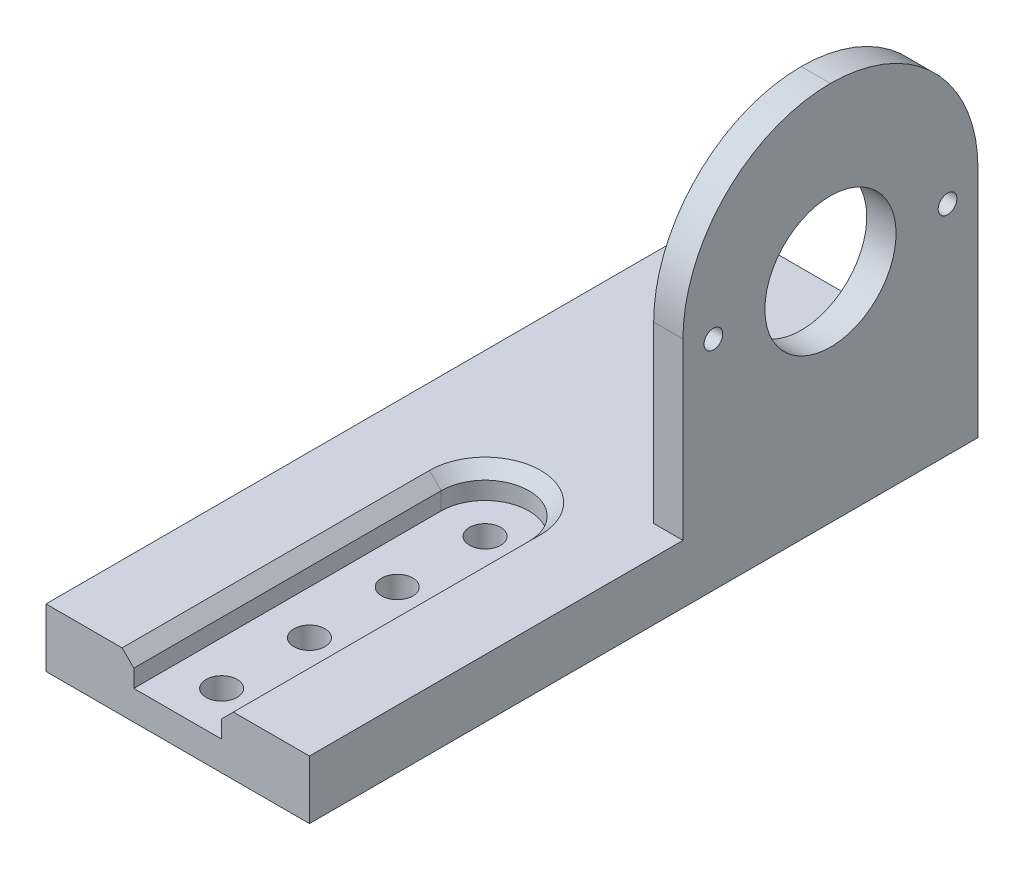
ISO-10303-21;
HEADER;
FILE_DESCRIPTION(('STEP AP214'),'2;1');
FILE_NAME('part.step','',(''),(''),'','','');
FILE_SCHEMA(('AUTOMOTIVE_DESIGN { 1 0 10303 214 1 1 1 1 }'));
ENDSEC;
DATA;
#1=APPLICATION_CONTEXT('core data for automotive mechanical design processes');
#2=APPLICATION_PROTOCOL_DEFINITION('international standard','automotive_design',2000,#1);
#3=PRODUCT_CONTEXT('',#1,'mechanical');
#4=PRODUCT('Part','Part','',(#3));
#5=PRODUCT_RELATED_PRODUCT_CATEGORY('part','',(#4));
#6=PRODUCT_DEFINITION_FORMATION('','',#4);
#7=PRODUCT_DEFINITION_CONTEXT('part definition',#1,'design');
#8=PRODUCT_DEFINITION('design','',#6,#7);
#9=PRODUCT_DEFINITION_SHAPE('','',#8);
#10=(LENGTH_UNIT() NAMED_UNIT(*) SI_UNIT(.MILLI.,.METRE.));
#11=(NAMED_UNIT(*) PLANE_ANGLE_UNIT() SI_UNIT($,.RADIAN.));
#12=(NAMED_UNIT(*) SI_UNIT($,.STERADIAN.) SOLID_ANGLE_UNIT());
#13=UNCERTAINTY_MEASURE_WITH_UNIT(LENGTH_MEASURE(1.E-05),#10,'distance_accuracy_value','');
#14=(GEOMETRIC_REPRESENTATION_CONTEXT(3) GLOBAL_UNCERTAINTY_ASSIGNED_CONTEXT((#13)) GLOBAL_UNIT_ASSIGNED_CONTEXT((#10,
#11,#12)) REPRESENTATION_CONTEXT('',''));
#15=CARTESIAN_POINT('',(0.,0.,0.));
#16=DIRECTION('',(0.,0.,1.));
#17=DIRECTION('',(1.,0.,0.));
#18=AXIS2_PLACEMENT_3D('',#15,#16,#17);
#19=CARTESIAN_POINT('',(28.575,12.7,-9.525));
#20=DIRECTION('',(0.,-1.,0.));
#21=DIRECTION('',(0.,0.,-1.));
#22=AXIS2_PLACEMENT_3D('',#19,#20,#21);
#23=CYLINDRICAL_SURFACE('',#22,3.3782);
#24=CARTESIAN_POINT('',(28.575,0.,-9.525));
#25=DIRECTION('',(0.,-1.,0.));
#26=DIRECTION('',(0.,0.,-1.));
#27=AXIS2_PLACEMENT_3D('',#24,#25,#26);
#28=CIRCLE('',#27,3.3782);
#29=CARTESIAN_POINT('',(28.575,0.,-12.9032));
#30=VERTEX_POINT('',#29);
#31=EDGE_CURVE('E173',#30,#30,#28,.T.);
#32=ORIENTED_EDGE('',*,*,#31,.T.);
#33=EDGE_LOOP('',(#32));
#34=FACE_BOUND('',#33,.T.);
#35=CARTESIAN_POINT('',(28.575,6.35,-9.525));
#36=DIRECTION('',(0.,1.,0.));
#37=DIRECTION('',(0.,0.,1.));
#38=AXIS2_PLACEMENT_3D('',#35,#36,#37);
#39=CIRCLE('',#38,3.3782);
#40=CARTESIAN_POINT('',(28.575,6.35,-6.1468));
#41=VERTEX_POINT('',#40);
#42=EDGE_CURVE('E282',#41,#41,#39,.F.);
#43=ORIENTED_EDGE('',*,*,#42,.F.);
#44=EDGE_LOOP('',(#43));
#45=FACE_BOUND('',#44,.T.);
#46=ADVANCED_FACE('F33',(#34,#45),#23,.F.);
#47=CARTESIAN_POINT('',(28.575,12.7,-28.575));
#48=DIRECTION('',(0.,-1.,0.));
#49=DIRECTION('',(0.,0.,-1.));
#50=AXIS2_PLACEMENT_3D('',#47,#48,#49);
#51=CYLINDRICAL_SURFACE('',#50,3.3782);
#52=CARTESIAN_POINT('',(28.575,0.,-28.575));
#53=DIRECTION('',(0.,-1.,0.));
#54=DIRECTION('',(0.,0.,-1.));
#55=AXIS2_PLACEMENT_3D('',#52,#53,#54);
#56=CIRCLE('',#55,3.3782);
#57=CARTESIAN_POINT('',(28.575,0.,-31.9532));
#58=VERTEX_POINT('',#57);
#59=EDGE_CURVE('E291',#58,#58,#56,.T.);
#60=ORIENTED_EDGE('',*,*,#59,.T.);
#61=EDGE_LOOP('',(#60));
#62=FACE_BOUND('',#61,.T.);
#63=CARTESIAN_POINT('',(28.575,6.35,-28.575));
#64=DIRECTION('',(0.,1.,0.));
#65=DIRECTION('',(0.,0.,1.));
#66=AXIS2_PLACEMENT_3D('',#63,#64,#65);
#67=CIRCLE('',#66,3.3782);
#68=CARTESIAN_POINT('',(28.575,6.35,-25.1968));
#69=VERTEX_POINT('',#68);
#70=EDGE_CURVE('E279',#69,#69,#67,.F.);
#71=ORIENTED_EDGE('',*,*,#70,.F.);
#72=EDGE_LOOP('',(#71));
#73=FACE_BOUND('',#72,.T.);
#74=ADVANCED_FACE('F346',(#62,#73),#51,.F.);
#75=CARTESIAN_POINT('',(28.575,12.7,-47.625));
#76=DIRECTION('',(0.,-1.,0.));
#77=DIRECTION('',(0.,0.,-1.));
#78=AXIS2_PLACEMENT_3D('',#75,#76,#77);
#79=CYLINDRICAL_SURFACE('',#78,3.3782);
#80=CARTESIAN_POINT('',(28.575,0.,-47.625));
#81=DIRECTION('',(0.,-1.,0.));
#82=DIRECTION('',(0.,0.,-1.));
#83=AXIS2_PLACEMENT_3D('',#80,#81,#82);
#84=CIRCLE('',#83,3.3782);
#85=CARTESIAN_POINT('',(28.575,0.,-51.0032));
#86=VERTEX_POINT('',#85);
#87=EDGE_CURVE('E288',#86,#86,#84,.T.);
#88=ORIENTED_EDGE('',*,*,#87,.T.);
#89=EDGE_LOOP('',(#88));
#90=FACE_BOUND('',#89,.T.);
#91=CARTESIAN_POINT('',(28.575,6.35,-47.625));
#92=DIRECTION('',(0.,1.,0.));
#93=DIRECTION('',(0.,0.,1.));
#94=AXIS2_PLACEMENT_3D('',#91,#92,#93);
#95=CIRCLE('',#94,3.3782);
#96=CARTESIAN_POINT('',(28.575,6.35,-44.2468));
#97=VERTEX_POINT('',#96);
#98=EDGE_CURVE('E194',#97,#97,#95,.F.);
#99=ORIENTED_EDGE('',*,*,#98,.F.);
#100=EDGE_LOOP('',(#99));
#101=FACE_BOUND('',#100,.T.);
#102=ADVANCED_FACE('F352',(#90,#101),#79,.F.);
#103=CARTESIAN_POINT('',(28.575,12.7,-66.675));
#104=DIRECTION('',(0.,-1.,0.));
#105=DIRECTION('',(0.,0.,-1.));
#106=AXIS2_PLACEMENT_3D('',#103,#104,#105);
#107=CYLINDRICAL_SURFACE('',#106,3.3782);
#108=CARTESIAN_POINT('',(28.575,0.,-66.675));
#109=DIRECTION('',(0.,-1.,0.));
#110=DIRECTION('',(0.,0.,-1.));
#111=AXIS2_PLACEMENT_3D('',#108,#109,#110);
#112=CIRCLE('',#111,3.3782);
#113=CARTESIAN_POINT('',(28.575,0.,-70.0532));
#114=VERTEX_POINT('',#113);
#115=EDGE_CURVE('E285',#114,#114,#112,.T.);
#116=ORIENTED_EDGE('',*,*,#115,.T.);
#117=EDGE_LOOP('',(#116));
#118=FACE_BOUND('',#117,.T.);
#119=CARTESIAN_POINT('',(28.575,6.35,-66.675));
#120=DIRECTION('',(0.,1.,0.));
#121=DIRECTION('',(0.,0.,1.));
#122=AXIS2_PLACEMENT_3D('',#119,#120,#121);
#123=CIRCLE('',#122,3.3782);
#124=CARTESIAN_POINT('',(28.575,6.35,-63.2968));
#125=VERTEX_POINT('',#124);
#126=EDGE_CURVE('E191',#125,#125,#123,.F.);
#127=ORIENTED_EDGE('',*,*,#126,.F.);
#128=EDGE_LOOP('',(#127));
#129=FACE_BOUND('',#128,.T.);
#130=ADVANCED_FACE('F373',(#118,#129),#107,.F.);
#131=CARTESIAN_POINT('',(0.,12.7,0.));
#132=DIRECTION('',(1.,0.,0.));
#133=DIRECTION('',(0.,0.,-1.));
#134=AXIS2_PLACEMENT_3D('',#131,#132,#133);
#135=PLANE('',#134);
#136=DIRECTION('',(0.,0.,1.));
#137=VECTOR('',#136,1.);
#138=CARTESIAN_POINT('',(0.,0.,0.));
#139=LINE('',#138,#137);
#140=CARTESIAN_POINT('',(0.,0.,-145.034));
#141=VERTEX_POINT('',#140);
#142=CARTESIAN_POINT('',(0.,0.,0.));
#143=VERTEX_POINT('',#142);
#144=EDGE_CURVE('E169',#141,#143,#139,.T.);
#145=ORIENTED_EDGE('',*,*,#144,.T.);
#146=DIRECTION('',(0.,-1.,0.));
#147=VECTOR('',#146,1.);
#148=CARTESIAN_POINT('',(0.,12.7,0.));
#149=LINE('',#148,#147);
#150=CARTESIAN_POINT('',(0.,12.7,0.));
#151=VERTEX_POINT('',#150);
#152=EDGE_CURVE('E187',#151,#143,#149,.T.);
#153=ORIENTED_EDGE('',*,*,#152,.F.);
#154=DIRECTION('',(0.,0.,1.));
#155=VECTOR('',#154,1.);
#156=CARTESIAN_POINT('',(0.,12.7,0.));
#157=LINE('',#156,#155);
#158=CARTESIAN_POINT('',(0.,12.7,-145.034));
#159=VERTEX_POINT('',#158);
#160=EDGE_CURVE('E180',#159,#151,#157,.T.);
#161=ORIENTED_EDGE('',*,*,#160,.F.);
#162=DIRECTION('',(0.,-1.,0.));
#163=VECTOR('',#162,1.);
#164=CARTESIAN_POINT('',(0.,12.7,-145.034));
#165=LINE('',#164,#163);
#166=EDGE_CURVE('E163',#159,#141,#165,.T.);
#167=ORIENTED_EDGE('',*,*,#166,.T.);
#168=EDGE_LOOP('',(#145,#153,#161,#167));
#169=FACE_BOUND('',#168,.T.);
#170=ADVANCED_FACE('F302',(#169),#135,.F.);
#171=CARTESIAN_POINT('',(0.,12.7,0.));
#172=DIRECTION('',(0.,0.,-1.));
#173=DIRECTION('',(-1.,0.,0.));
#174=AXIS2_PLACEMENT_3D('',#171,#172,#173);
#175=PLANE('',#174);
#176=DIRECTION('',(0.,1.,0.));
#177=VECTOR('',#176,1.);
#178=CARTESIAN_POINT('',(19.05,6.35,0.));
#179=LINE('',#178,#177);
#180=CARTESIAN_POINT('',(19.05,6.35,0.));
#181=VERTEX_POINT('',#180);
#182=CARTESIAN_POINT('',(19.05,10.16,0.));
#183=VERTEX_POINT('',#182);
#184=EDGE_CURVE('E272',#181,#183,#179,.T.);
#185=ORIENTED_EDGE('',*,*,#184,.T.);
#186=DIRECTION('',(0.707106781186549,-0.707106781186546,0.));
#187=VECTOR('',#186,1.);
#188=CARTESIAN_POINT('',(19.05,10.16,0.));
#189=LINE('',#188,#187);
#190=CARTESIAN_POINT('',(16.51,12.7,0.));
#191=VERTEX_POINT('',#190);
#192=EDGE_CURVE('E200',#183,#191,#189,.F.);
#193=ORIENTED_EDGE('',*,*,#192,.T.);
#194=DIRECTION('',(1.,0.,0.));
#195=VECTOR('',#194,1.);
#196=CARTESIAN_POINT('',(0.,12.7,0.));
#197=LINE('',#196,#195);
#198=EDGE_CURVE('E161',#151,#191,#197,.T.);
#199=ORIENTED_EDGE('',*,*,#198,.F.);
#200=ORIENTED_EDGE('',*,*,#152,.T.);
#201=DIRECTION('',(1.,0.,0.));
#202=VECTOR('',#201,1.);
#203=CARTESIAN_POINT('',(0.,0.,0.));
#204=LINE('',#203,#202);
#205=CARTESIAN_POINT('',(57.15,0.,0.));
#206=VERTEX_POINT('',#205);
#207=EDGE_CURVE('E172',#143,#206,#204,.T.);
#208=ORIENTED_EDGE('',*,*,#207,.T.);
#209=DIRECTION('',(0.,-1.,0.));
#210=VECTOR('',#209,1.);
#211=CARTESIAN_POINT('',(57.15,12.7,0.));
#212=LINE('',#211,#210);
#213=CARTESIAN_POINT('',(57.15,12.7,0.));
#214=VERTEX_POINT('',#213);
#215=EDGE_CURVE('E185',#214,#206,#212,.T.);
#216=ORIENTED_EDGE('',*,*,#215,.F.);
#217=CARTESIAN_POINT('',(40.64,12.7,0.));
#218=VERTEX_POINT('',#217);
#219=EDGE_CURVE('E158',#218,#214,#197,.T.);
#220=ORIENTED_EDGE('',*,*,#219,.F.);
#221=DIRECTION('',(0.707106781186549,0.707106781186546,0.));
#222=VECTOR('',#221,1.);
#223=CARTESIAN_POINT('',(38.1,10.16,0.));
#224=LINE('',#223,#222);
#225=CARTESIAN_POINT('',(38.1,10.16,0.));
#226=VERTEX_POINT('',#225);
#227=EDGE_CURVE('E198',#218,#226,#224,.F.);
#228=ORIENTED_EDGE('',*,*,#227,.T.);
#229=DIRECTION('',(0.,1.,0.));
#230=VECTOR('',#229,1.);
#231=CARTESIAN_POINT('',(38.1,6.35,0.));
#232=LINE('',#231,#230);
#233=CARTESIAN_POINT('',(38.1,6.35,0.));
#234=VERTEX_POINT('',#233);
#235=EDGE_CURVE('E269',#234,#226,#232,.T.);
#236=ORIENTED_EDGE('',*,*,#235,.F.);
#237=DIRECTION('',(1.,0.,0.));
#238=VECTOR('',#237,1.);
#239=CARTESIAN_POINT('',(19.05,6.35,0.));
#240=LINE('',#239,#238);
#241=EDGE_CURVE('E261',#181,#234,#240,.T.);
#242=ORIENTED_EDGE('',*,*,#241,.F.);
#243=EDGE_LOOP('',(#185,#193,#199,#200,#208,#216,#220,#228,#236,#242));
#244=FACE_BOUND('',#243,.T.);
#245=ADVANCED_FACE('F305',(#244),#175,.F.);
#246=CARTESIAN_POINT('',(57.15,12.7,0.));
#247=DIRECTION('',(-1.,0.,0.));
#248=DIRECTION('',(0.,0.,1.));
#249=AXIS2_PLACEMENT_3D('',#246,#247,#248);
#250=PLANE('',#249);
#251=CARTESIAN_POINT('',(57.15,47.217289290586,-138.43));
#252=DIRECTION('',(-1.,0.,0.));
#253=DIRECTION('',(0.,0.,1.));
#254=AXIS2_PLACEMENT_3D('',#251,#252,#253);
#255=CIRCLE('',#254,2.03200000000001);
#256=CARTESIAN_POINT('',(57.15,47.217289290586,-136.398));
#257=VERTEX_POINT('',#256);
#258=EDGE_CURVE('E235',#257,#257,#255,.T.);
#259=ORIENTED_EDGE('',*,*,#258,.T.);
#260=EDGE_LOOP('',(#259));
#261=FACE_BOUND('',#260,.T.);
#262=CARTESIAN_POINT('',(57.15,47.217289290586,-87.63));
#263=DIRECTION('',(-1.,0.,0.));
#264=DIRECTION('',(0.,0.,1.));
#265=AXIS2_PLACEMENT_3D('',#262,#263,#264);
#266=CIRCLE('',#265,2.03200000000001);
#267=CARTESIAN_POINT('',(57.15,47.217289290586,-85.598));
#268=VERTEX_POINT('',#267);
#269=EDGE_CURVE('E245',#268,#268,#266,.T.);
#270=ORIENTED_EDGE('',*,*,#269,.T.);
#271=EDGE_LOOP('',(#270));
#272=FACE_BOUND('',#271,.T.);
#273=CARTESIAN_POINT('',(57.15,47.217289290586,-113.03));
#274=DIRECTION('',(-1.,0.,0.));
#275=DIRECTION('',(0.,0.,1.));
#276=AXIS2_PLACEMENT_3D('',#273,#274,#275);
#277=CIRCLE('',#276,14.224);
#278=CARTESIAN_POINT('',(57.15,47.217289290586,-98.806));
#279=VERTEX_POINT('',#278);
#280=EDGE_CURVE('E144',#279,#279,#277,.T.);
#281=ORIENTED_EDGE('',*,*,#280,.T.);
#282=EDGE_LOOP('',(#281));
#283=FACE_BOUND('',#282,.T.);
#284=CARTESIAN_POINT('',(57.15,50.546,-113.03));
#285=DIRECTION('',(-1.,0.,0.));
#286=DIRECTION('',(0.,0.,1.));
#287=AXIS2_PLACEMENT_3D('',#284,#285,#286);
#288=CIRCLE('',#287,32.004);
#289=CARTESIAN_POINT('',(57.15,50.546,-145.034));
#290=VERTEX_POINT('',#289);
#291=CARTESIAN_POINT('',(57.15,82.55,-113.03));
#292=VERTEX_POINT('',#291);
#293=EDGE_CURVE('E49',#290,#292,#288,.F.);
#294=ORIENTED_EDGE('',*,*,#293,.T.);
#295=CARTESIAN_POINT('',(57.15,50.546,-113.03));
#296=DIRECTION('',(-1.,0.,0.));
#297=DIRECTION('',(0.,0.,1.));
#298=AXIS2_PLACEMENT_3D('',#295,#296,#297);
#299=CIRCLE('',#298,32.004);
#300=CARTESIAN_POINT('',(57.15,50.546,-81.026));
#301=VERTEX_POINT('',#300);
#302=EDGE_CURVE('E42',#292,#301,#299,.F.);
#303=ORIENTED_EDGE('',*,*,#302,.T.);
#304=DIRECTION('',(0.,-1.,0.));
#305=VECTOR('',#304,1.);
#306=CARTESIAN_POINT('',(57.15,82.55,-81.026));
#307=LINE('',#306,#305);
#308=CARTESIAN_POINT('',(57.15,12.7,-81.026));
#309=VERTEX_POINT('',#308);
#310=EDGE_CURVE('E133',#301,#309,#307,.T.);
#311=ORIENTED_EDGE('',*,*,#310,.T.);
#312=DIRECTION('',(0.,0.,-1.));
#313=VECTOR('',#312,1.);
#314=CARTESIAN_POINT('',(57.15,12.7,0.));
#315=LINE('',#314,#313);
#316=EDGE_CURVE('E138',#214,#309,#315,.T.);
#317=ORIENTED_EDGE('',*,*,#316,.F.);
#318=ORIENTED_EDGE('',*,*,#215,.T.);
#319=DIRECTION('',(0.,0.,-1.));
#320=VECTOR('',#319,1.);
#321=CARTESIAN_POINT('',(57.15,0.,0.));
#322=LINE('',#321,#320);
#323=CARTESIAN_POINT('',(57.15,0.,-145.034));
#324=VERTEX_POINT('',#323);
#325=EDGE_CURVE('E175',#206,#324,#322,.T.);
#326=ORIENTED_EDGE('',*,*,#325,.T.);
#327=DIRECTION('',(0.,-1.,0.));
#328=VECTOR('',#327,1.);
#329=CARTESIAN_POINT('',(57.15,12.7,-145.034));
#330=LINE('',#329,#328);
#331=EDGE_CURVE('E183',#290,#324,#330,.T.);
#332=ORIENTED_EDGE('',*,*,#331,.F.);
#333=EDGE_LOOP('',(#294,#303,#311,#317,#318,#326,#332));
#334=FACE_BOUND('',#333,.T.);
#335=ADVANCED_FACE('F135',(#261,#272,#283,#334),#250,.F.);
#336=CARTESIAN_POINT('',(0.,12.7,-145.034));
#337=DIRECTION('',(0.,0.,1.));
#338=DIRECTION('',(1.,0.,0.));
#339=AXIS2_PLACEMENT_3D('',#336,#337,#338);
#340=PLANE('',#339);
#341=DIRECTION('',(0.,-1.,0.));
#342=VECTOR('',#341,1.);
#343=CARTESIAN_POINT('',(50.8,82.55,-145.034));
#344=LINE('',#343,#342);
#345=CARTESIAN_POINT('',(50.8,50.546,-145.034));
#346=VERTEX_POINT('',#345);
#347=CARTESIAN_POINT('',(50.8,12.7,-145.034));
#348=VERTEX_POINT('',#347);
#349=EDGE_CURVE('E154',#346,#348,#344,.T.);
#350=ORIENTED_EDGE('',*,*,#349,.F.);
#351=DIRECTION('',(1.,0.,0.));
#352=VECTOR('',#351,1.);
#353=CARTESIAN_POINT('',(57.15,50.546,-145.034));
#354=LINE('',#353,#352);
#355=EDGE_CURVE('E11',#346,#290,#354,.T.);
#356=ORIENTED_EDGE('',*,*,#355,.T.);
#357=ORIENTED_EDGE('',*,*,#331,.T.);
#358=DIRECTION('',(-1.,0.,0.));
#359=VECTOR('',#358,1.);
#360=CARTESIAN_POINT('',(0.,0.,-145.034));
#361=LINE('',#360,#359);
#362=EDGE_CURVE('E178',#324,#141,#361,.T.);
#363=ORIENTED_EDGE('',*,*,#362,.T.);
#364=ORIENTED_EDGE('',*,*,#166,.F.);
#365=DIRECTION('',(-1.,0.,0.));
#366=VECTOR('',#365,1.);
#367=CARTESIAN_POINT('',(0.,12.7,-145.034));
#368=LINE('',#367,#366);
#369=EDGE_CURVE('E160',#348,#159,#368,.T.);
#370=ORIENTED_EDGE('',*,*,#369,.F.);
#371=EDGE_LOOP('',(#350,#356,#357,#363,#364,#370));
#372=FACE_BOUND('',#371,.T.);
#373=ADVANCED_FACE('F360',(#372),#340,.F.);
#374=CARTESIAN_POINT('',(0.,12.7,0.));
#375=DIRECTION('',(0.,-1.,0.));
#376=DIRECTION('',(0.,0.,-1.));
#377=AXIS2_PLACEMENT_3D('',#374,#375,#376);
#378=PLANE('',#377);
#379=DIRECTION('',(-1.,0.,0.));
#380=VECTOR('',#379,1.);
#381=CARTESIAN_POINT('',(0.,12.7,-81.026));
#382=LINE('',#381,#380);
#383=CARTESIAN_POINT('',(50.8,12.7,-81.026));
#384=VERTEX_POINT('',#383);
#385=EDGE_CURVE('E147',#309,#384,#382,.T.);
#386=ORIENTED_EDGE('',*,*,#385,.T.);
#387=DIRECTION('',(0.,0.,-1.));
#388=VECTOR('',#387,1.);
#389=CARTESIAN_POINT('',(50.8,12.7,0.));
#390=LINE('',#389,#388);
#391=EDGE_CURVE('E153',#384,#348,#390,.T.);
#392=ORIENTED_EDGE('',*,*,#391,.T.);
#393=ORIENTED_EDGE('',*,*,#369,.T.);
#394=ORIENTED_EDGE('',*,*,#160,.T.);
#395=ORIENTED_EDGE('',*,*,#198,.T.);
#396=DIRECTION('',(0.,0.,-1.));
#397=VECTOR('',#396,1.);
#398=CARTESIAN_POINT('',(16.51,12.7,0.));
#399=LINE('',#398,#397);
#400=CARTESIAN_POINT('',(16.51,12.7,-66.675));
#401=VERTEX_POINT('',#400);
#402=EDGE_CURVE('E206',#191,#401,#399,.T.);
#403=ORIENTED_EDGE('',*,*,#402,.T.);
#404=CARTESIAN_POINT('',(28.575,12.7,-66.675));
#405=DIRECTION('',(0.,-1.,0.));
#406=DIRECTION('',(0.,0.,-1.));
#407=AXIS2_PLACEMENT_3D('',#404,#405,#406);
#408=CIRCLE('',#407,12.065);
#409=CARTESIAN_POINT('',(40.64,12.7,-66.675));
#410=VERTEX_POINT('',#409);
#411=EDGE_CURVE('E204',#401,#410,#408,.T.);
#412=ORIENTED_EDGE('',*,*,#411,.T.);
#413=DIRECTION('',(0.,0.,1.));
#414=VECTOR('',#413,1.);
#415=CARTESIAN_POINT('',(40.64,12.7,0.));
#416=LINE('',#415,#414);
#417=EDGE_CURVE('E202',#410,#218,#416,.T.);
#418=ORIENTED_EDGE('',*,*,#417,.T.);
#419=ORIENTED_EDGE('',*,*,#219,.T.);
#420=ORIENTED_EDGE('',*,*,#316,.T.);
#421=EDGE_LOOP('',(#386,#392,#393,#394,#395,#403,#412,#418,#419,#420));
#422=FACE_BOUND('',#421,.T.);
#423=ADVANCED_FACE('F156',(#422),#378,.F.);
#424=CARTESIAN_POINT('',(0.,0.,0.));
#425=DIRECTION('',(0.,-1.,0.));
#426=DIRECTION('',(0.,0.,-1.));
#427=AXIS2_PLACEMENT_3D('',#424,#425,#426);
#428=PLANE('',#427);
#429=ORIENTED_EDGE('',*,*,#144,.F.);
#430=ORIENTED_EDGE('',*,*,#362,.F.);
#431=ORIENTED_EDGE('',*,*,#325,.F.);
#432=ORIENTED_EDGE('',*,*,#207,.F.);
#433=EDGE_LOOP('',(#429,#430,#431,#432));
#434=FACE_BOUND('',#433,.T.);
#435=ORIENTED_EDGE('',*,*,#115,.F.);
#436=EDGE_LOOP('',(#435));
#437=FACE_BOUND('',#436,.T.);
#438=ORIENTED_EDGE('',*,*,#87,.F.);
#439=EDGE_LOOP('',(#438));
#440=FACE_BOUND('',#439,.T.);
#441=ORIENTED_EDGE('',*,*,#59,.F.);
#442=EDGE_LOOP('',(#441));
#443=FACE_BOUND('',#442,.T.);
#444=ORIENTED_EDGE('',*,*,#31,.F.);
#445=EDGE_LOOP('',(#444));
#446=FACE_BOUND('',#445,.T.);
#447=ADVANCED_FACE('F341',(#434,#437,#440,#443,#446),#428,.T.);
#448=CARTESIAN_POINT('',(28.575,6.35,-66.675));
#449=DIRECTION('',(0.,1.,0.));
#450=DIRECTION('',(0.,0.,1.));
#451=AXIS2_PLACEMENT_3D('',#448,#449,#450);
#452=PLANE('',#451);
#453=CARTESIAN_POINT('',(28.575,6.35,-66.675));
#454=DIRECTION('',(0.,1.,0.));
#455=DIRECTION('',(0.,0.,1.));
#456=AXIS2_PLACEMENT_3D('',#453,#454,#455);
#457=CIRCLE('',#456,9.525);
#458=CARTESIAN_POINT('',(38.1,6.35,-66.675));
#459=VERTEX_POINT('',#458);
#460=CARTESIAN_POINT('',(19.05,6.35,-66.675));
#461=VERTEX_POINT('',#460);
#462=EDGE_CURVE('E219',#459,#461,#457,.T.);
#463=ORIENTED_EDGE('',*,*,#462,.T.);
#464=DIRECTION('',(0.,0.,1.));
#465=VECTOR('',#464,1.);
#466=CARTESIAN_POINT('',(19.05,6.35,-66.675));
#467=LINE('',#466,#465);
#468=EDGE_CURVE('E258',#461,#181,#467,.T.);
#469=ORIENTED_EDGE('',*,*,#468,.T.);
#470=ORIENTED_EDGE('',*,*,#241,.T.);
#471=DIRECTION('',(0.,0.,-1.));
#472=VECTOR('',#471,1.);
#473=CARTESIAN_POINT('',(38.1,6.35,0.));
#474=LINE('',#473,#472);
#475=EDGE_CURVE('E263',#234,#459,#474,.T.);
#476=ORIENTED_EDGE('',*,*,#475,.T.);
#477=EDGE_LOOP('',(#463,#469,#470,#476));
#478=FACE_BOUND('',#477,.T.);
#479=ORIENTED_EDGE('',*,*,#126,.T.);
#480=EDGE_LOOP('',(#479));
#481=FACE_BOUND('',#480,.T.);
#482=ORIENTED_EDGE('',*,*,#98,.T.);
#483=EDGE_LOOP('',(#482));
#484=FACE_BOUND('',#483,.T.);
#485=ORIENTED_EDGE('',*,*,#70,.T.);
#486=EDGE_LOOP('',(#485));
#487=FACE_BOUND('',#486,.T.);
#488=ORIENTED_EDGE('',*,*,#42,.T.);
#489=EDGE_LOOP('',(#488));
#490=FACE_BOUND('',#489,.T.);
#491=ADVANCED_FACE('F331',(#478,#481,#484,#487,#490),#452,.T.);
#492=CARTESIAN_POINT('',(28.575,6.35,-66.675));
#493=DIRECTION('',(0.,1.,0.));
#494=DIRECTION('',(0.,0.,1.));
#495=AXIS2_PLACEMENT_3D('',#492,#493,#494);
#496=CYLINDRICAL_SURFACE('',#495,9.525);
#497=DIRECTION('',(0.,1.,0.));
#498=VECTOR('',#497,1.);
#499=CARTESIAN_POINT('',(38.1,6.35,-66.675));
#500=LINE('',#499,#498);
#501=CARTESIAN_POINT('',(38.1,10.16,-66.675));
#502=VERTEX_POINT('',#501);
#503=EDGE_CURVE('E195',#459,#502,#500,.T.);
#504=ORIENTED_EDGE('',*,*,#503,.T.);
#505=CARTESIAN_POINT('',(28.575,10.16,-66.675));
#506=DIRECTION('',(0.,-1.,0.));
#507=DIRECTION('',(0.,0.,-1.));
#508=AXIS2_PLACEMENT_3D('',#505,#506,#507);
#509=CIRCLE('',#508,9.525);
#510=CARTESIAN_POINT('',(19.05,10.16,-66.675));
#511=VERTEX_POINT('',#510);
#512=EDGE_CURVE('E208',#502,#511,#509,.F.);
#513=ORIENTED_EDGE('',*,*,#512,.T.);
#514=DIRECTION('',(0.,1.,0.));
#515=VECTOR('',#514,1.);
#516=CARTESIAN_POINT('',(19.05,6.35,-66.675));
#517=LINE('',#516,#515);
#518=EDGE_CURVE('E266',#461,#511,#517,.T.);
#519=ORIENTED_EDGE('',*,*,#518,.F.);
#520=ORIENTED_EDGE('',*,*,#462,.F.);
#521=EDGE_LOOP('',(#504,#513,#519,#520));
#522=FACE_BOUND('',#521,.T.);
#523=ADVANCED_FACE('F333',(#522),#496,.F.);
#524=CARTESIAN_POINT('',(38.1,6.35,0.));
#525=DIRECTION('',(1.,0.,0.));
#526=DIRECTION('',(0.,0.,-1.));
#527=AXIS2_PLACEMENT_3D('',#524,#525,#526);
#528=PLANE('',#527);
#529=ORIENTED_EDGE('',*,*,#235,.T.);
#530=DIRECTION('',(0.,0.,-1.));
#531=VECTOR('',#530,1.);
#532=CARTESIAN_POINT('',(38.1,10.16,0.));
#533=LINE('',#532,#531);
#534=EDGE_CURVE('E210',#226,#502,#533,.T.);
#535=ORIENTED_EDGE('',*,*,#534,.T.);
#536=ORIENTED_EDGE('',*,*,#503,.F.);
#537=ORIENTED_EDGE('',*,*,#475,.F.);
#538=EDGE_LOOP('',(#529,#535,#536,#537));
#539=FACE_BOUND('',#538,.T.);
#540=ADVANCED_FACE('F329',(#539),#528,.F.);
#541=CARTESIAN_POINT('',(19.05,6.35,-66.675));
#542=DIRECTION('',(-1.,0.,0.));
#543=DIRECTION('',(0.,0.,1.));
#544=AXIS2_PLACEMENT_3D('',#541,#542,#543);
#545=PLANE('',#544);
#546=ORIENTED_EDGE('',*,*,#518,.T.);
#547=DIRECTION('',(0.,0.,1.));
#548=VECTOR('',#547,1.);
#549=CARTESIAN_POINT('',(19.05,10.16,-66.675));
#550=LINE('',#549,#548);
#551=EDGE_CURVE('E190',#511,#183,#550,.T.);
#552=ORIENTED_EDGE('',*,*,#551,.T.);
#553=ORIENTED_EDGE('',*,*,#184,.F.);
#554=ORIENTED_EDGE('',*,*,#468,.F.);
#555=EDGE_LOOP('',(#546,#552,#553,#554));
#556=FACE_BOUND('',#555,.T.);
#557=ADVANCED_FACE('F311',(#556),#545,.F.);
#558=CARTESIAN_POINT('',(38.1,10.16,0.));
#559=DIRECTION('',(0.707106781186546,-0.707106781186549,0.));
#560=DIRECTION('',(0.,0.,-1.));
#561=AXIS2_PLACEMENT_3D('',#558,#559,#560);
#562=PLANE('',#561);
#563=ORIENTED_EDGE('',*,*,#227,.F.);
#564=ORIENTED_EDGE('',*,*,#417,.F.);
#565=DIRECTION('',(0.707106781186549,0.707106781186546,0.));
#566=VECTOR('',#565,1.);
#567=CARTESIAN_POINT('',(38.1,10.16,-66.675));
#568=LINE('',#567,#566);
#569=EDGE_CURVE('E216',#502,#410,#568,.T.);
#570=ORIENTED_EDGE('',*,*,#569,.F.);
#571=ORIENTED_EDGE('',*,*,#534,.F.);
#572=EDGE_LOOP('',(#563,#564,#570,#571));
#573=FACE_BOUND('',#572,.T.);
#574=ADVANCED_FACE('F324',(#573),#562,.F.);
#575=CARTESIAN_POINT('',(28.575,10.16,-66.675));
#576=DIRECTION('',(0.,1.,0.));
#577=DIRECTION('',(0.,0.,1.));
#578=AXIS2_PLACEMENT_3D('',#575,#576,#577);
#579=CONICAL_SURFACE('',#578,9.525,0.785398163397451);
#580=ORIENTED_EDGE('',*,*,#569,.T.);
#581=ORIENTED_EDGE('',*,*,#411,.F.);
#582=DIRECTION('',(-0.707106781186549,0.707106781186546,0.));
#583=VECTOR('',#582,1.);
#584=CARTESIAN_POINT('',(19.05,10.16,-66.675));
#585=LINE('',#584,#583);
#586=EDGE_CURVE('E213',#511,#401,#585,.T.);
#587=ORIENTED_EDGE('',*,*,#586,.F.);
#588=ORIENTED_EDGE('',*,*,#512,.F.);
#589=EDGE_LOOP('',(#580,#581,#587,#588));
#590=FACE_BOUND('',#589,.T.);
#591=ADVANCED_FACE('F319',(#590),#579,.F.);
#592=CARTESIAN_POINT('',(19.05,10.16,-66.675));
#593=DIRECTION('',(-0.707106781186546,-0.707106781186549,0.));
#594=DIRECTION('',(0.,0.,1.));
#595=AXIS2_PLACEMENT_3D('',#592,#593,#594);
#596=PLANE('',#595);
#597=ORIENTED_EDGE('',*,*,#586,.T.);
#598=ORIENTED_EDGE('',*,*,#402,.F.);
#599=ORIENTED_EDGE('',*,*,#192,.F.);
#600=ORIENTED_EDGE('',*,*,#551,.F.);
#601=EDGE_LOOP('',(#597,#598,#599,#600));
#602=FACE_BOUND('',#601,.T.);
#603=ADVANCED_FACE('F309',(#602),#596,.F.);
#604=CARTESIAN_POINT('',(50.8,82.55,-81.026));
#605=DIRECTION('',(-1.,0.,0.));
#606=DIRECTION('',(0.,0.,1.));
#607=AXIS2_PLACEMENT_3D('',#604,#605,#606);
#608=PLANE('',#607);
#609=CARTESIAN_POINT('',(50.8,47.217289290586,-138.43));
#610=DIRECTION('',(-1.,0.,0.));
#611=DIRECTION('',(0.,0.,1.));
#612=AXIS2_PLACEMENT_3D('',#609,#610,#611);
#613=CIRCLE('',#612,2.03200000000001);
#614=CARTESIAN_POINT('',(50.8,47.217289290586,-136.398));
#615=VERTEX_POINT('',#614);
#616=EDGE_CURVE('E233',#615,#615,#613,.T.);
#617=ORIENTED_EDGE('',*,*,#616,.F.);
#618=EDGE_LOOP('',(#617));
#619=FACE_BOUND('',#618,.T.);
#620=CARTESIAN_POINT('',(50.8,47.217289290586,-87.63));
#621=DIRECTION('',(-1.,0.,0.));
#622=DIRECTION('',(0.,0.,1.));
#623=AXIS2_PLACEMENT_3D('',#620,#621,#622);
#624=CIRCLE('',#623,2.03200000000001);
#625=CARTESIAN_POINT('',(50.8,47.217289290586,-85.598));
#626=VERTEX_POINT('',#625);
#627=EDGE_CURVE('E240',#626,#626,#624,.T.);
#628=ORIENTED_EDGE('',*,*,#627,.F.);
#629=EDGE_LOOP('',(#628));
#630=FACE_BOUND('',#629,.T.);
#631=CARTESIAN_POINT('',(50.8,47.217289290586,-113.03));
#632=DIRECTION('',(-1.,0.,0.));
#633=DIRECTION('',(0.,0.,1.));
#634=AXIS2_PLACEMENT_3D('',#631,#632,#633);
#635=CIRCLE('',#634,14.224);
#636=CARTESIAN_POINT('',(50.8,47.217289290586,-98.806));
#637=VERTEX_POINT('',#636);
#638=EDGE_CURVE('E248',#637,#637,#635,.T.);
#639=ORIENTED_EDGE('',*,*,#638,.F.);
#640=EDGE_LOOP('',(#639));
#641=FACE_BOUND('',#640,.T.);
#642=DIRECTION('',(0.,-1.,0.));
#643=VECTOR('',#642,1.);
#644=CARTESIAN_POINT('',(50.8,82.55,-81.026));
#645=LINE('',#644,#643);
#646=CARTESIAN_POINT('',(50.8,50.546,-81.026));
#647=VERTEX_POINT('',#646);
#648=EDGE_CURVE('E143',#647,#384,#645,.T.);
#649=ORIENTED_EDGE('',*,*,#648,.F.);
#650=CARTESIAN_POINT('',(50.8,50.546,-113.03));
#651=DIRECTION('',(-1.,0.,0.));
#652=DIRECTION('',(0.,0.,1.));
#653=AXIS2_PLACEMENT_3D('',#650,#651,#652);
#654=CIRCLE('',#653,32.004);
#655=CARTESIAN_POINT('',(50.8,82.55,-113.03));
#656=VERTEX_POINT('',#655);
#657=EDGE_CURVE('E223',#647,#656,#654,.T.);
#658=ORIENTED_EDGE('',*,*,#657,.T.);
#659=CARTESIAN_POINT('',(50.8,50.546,-113.03));
#660=DIRECTION('',(-1.,0.,0.));
#661=DIRECTION('',(0.,0.,1.));
#662=AXIS2_PLACEMENT_3D('',#659,#660,#661);
#663=CIRCLE('',#662,32.004);
#664=EDGE_CURVE('E221',#656,#346,#663,.T.);
#665=ORIENTED_EDGE('',*,*,#664,.T.);
#666=ORIENTED_EDGE('',*,*,#349,.T.);
#667=ORIENTED_EDGE('',*,*,#391,.F.);
#668=EDGE_LOOP('',(#649,#658,#665,#666,#667));
#669=FACE_BOUND('',#668,.T.);
#670=ADVANCED_FACE('F228',(#619,#630,#641,#669),#608,.T.);
#671=CARTESIAN_POINT('',(57.15,82.55,-81.026));
#672=DIRECTION('',(0.,0.,1.));
#673=DIRECTION('',(1.,0.,0.));
#674=AXIS2_PLACEMENT_3D('',#671,#672,#673);
#675=PLANE('',#674);
#676=ORIENTED_EDGE('',*,*,#310,.F.);
#677=DIRECTION('',(-1.,0.,0.));
#678=VECTOR('',#677,1.);
#679=CARTESIAN_POINT('',(57.15,50.546,-81.026));
#680=LINE('',#679,#678);
#681=EDGE_CURVE('E212',#301,#647,#680,.T.);
#682=ORIENTED_EDGE('',*,*,#681,.T.);
#683=ORIENTED_EDGE('',*,*,#648,.T.);
#684=ORIENTED_EDGE('',*,*,#385,.F.);
#685=EDGE_LOOP('',(#676,#682,#683,#684));
#686=FACE_BOUND('',#685,.T.);
#687=ADVANCED_FACE('F148',(#686),#675,.T.);
#688=CARTESIAN_POINT('',(133.35,47.217289290586,-113.03));
#689=DIRECTION('',(-1.,0.,0.));
#690=DIRECTION('',(0.,0.,1.));
#691=AXIS2_PLACEMENT_3D('',#688,#689,#690);
#692=CYLINDRICAL_SURFACE('',#691,14.224);
#693=ORIENTED_EDGE('',*,*,#638,.T.);
#694=EDGE_LOOP('',(#693));
#695=FACE_BOUND('',#694,.T.);
#696=ORIENTED_EDGE('',*,*,#280,.F.);
#697=EDGE_LOOP('',(#696));
#698=FACE_BOUND('',#697,.T.);
#699=ADVANCED_FACE('F392',(#695,#698),#692,.F.);
#700=CARTESIAN_POINT('',(133.35,47.217289290586,-87.63));
#701=DIRECTION('',(-1.,0.,0.));
#702=DIRECTION('',(0.,0.,1.));
#703=AXIS2_PLACEMENT_3D('',#700,#701,#702);
#704=CYLINDRICAL_SURFACE('',#703,2.03200000000001);
#705=ORIENTED_EDGE('',*,*,#627,.T.);
#706=EDGE_LOOP('',(#705));
#707=FACE_BOUND('',#706,.T.);
#708=ORIENTED_EDGE('',*,*,#269,.F.);
#709=EDGE_LOOP('',(#708));
#710=FACE_BOUND('',#709,.T.);
#711=ADVANCED_FACE('F387',(#707,#710),#704,.F.);
#712=CARTESIAN_POINT('',(133.35,47.217289290586,-138.43));
#713=DIRECTION('',(-1.,0.,0.));
#714=DIRECTION('',(0.,0.,1.));
#715=AXIS2_PLACEMENT_3D('',#712,#713,#714);
#716=CYLINDRICAL_SURFACE('',#715,2.03200000000001);
#717=ORIENTED_EDGE('',*,*,#616,.T.);
#718=EDGE_LOOP('',(#717));
#719=FACE_BOUND('',#718,.T.);
#720=ORIENTED_EDGE('',*,*,#258,.F.);
#721=EDGE_LOOP('',(#720));
#722=FACE_BOUND('',#721,.T.);
#723=ADVANCED_FACE('F383',(#719,#722),#716,.F.);
#724=CARTESIAN_POINT('',(0.,50.546,-113.03));
#725=DIRECTION('',(-1.,0.,0.));
#726=DIRECTION('',(0.,0.,1.));
#727=AXIS2_PLACEMENT_3D('',#724,#725,#726);
#728=CYLINDRICAL_SURFACE('',#727,32.004);
#729=DIRECTION('',(1.,0.,0.));
#730=VECTOR('',#729,1.);
#731=CARTESIAN_POINT('',(50.8,82.55,-113.03));
#732=LINE('',#731,#730);
#733=EDGE_CURVE('E37',#292,#656,#732,.F.);
#734=ORIENTED_EDGE('',*,*,#733,.F.);
#735=ORIENTED_EDGE('',*,*,#293,.F.);
#736=ORIENTED_EDGE('',*,*,#355,.F.);
#737=ORIENTED_EDGE('',*,*,#664,.F.);
#738=EDGE_LOOP('',(#734,#735,#736,#737));
#739=FACE_BOUND('',#738,.T.);
#740=ADVANCED_FACE('F35',(#739),#728,.T.);
#741=CARTESIAN_POINT('',(57.15,50.546,-113.03));
#742=DIRECTION('',(-1.,0.,0.));
#743=DIRECTION('',(0.,0.,1.));
#744=AXIS2_PLACEMENT_3D('',#741,#742,#743);
#745=CYLINDRICAL_SURFACE('',#744,32.004);
#746=ORIENTED_EDGE('',*,*,#302,.F.);
#747=ORIENTED_EDGE('',*,*,#733,.T.);
#748=ORIENTED_EDGE('',*,*,#657,.F.);
#749=ORIENTED_EDGE('',*,*,#681,.F.);
#750=EDGE_LOOP('',(#746,#747,#748,#749));
#751=FACE_BOUND('',#750,.T.);
#752=ADVANCED_FACE('F232',(#751),#745,.T.);
#753=CLOSED_SHELL('',(#46,#74,#102,#130,#170,#245,#335,#373,#423,#447,#491,#523,#540,#557,#574,
#591,#603,#670,#687,#699,#711,#723,#740,#752));
#754=MANIFOLD_SOLID_BREP('B2',#753);
#755=ADVANCED_BREP_SHAPE_REPRESENTATION('',(#18,#754),#14);
#756=SHAPE_DEFINITION_REPRESENTATION(#9,#755);
ENDSEC;
END-ISO-10303-21;
